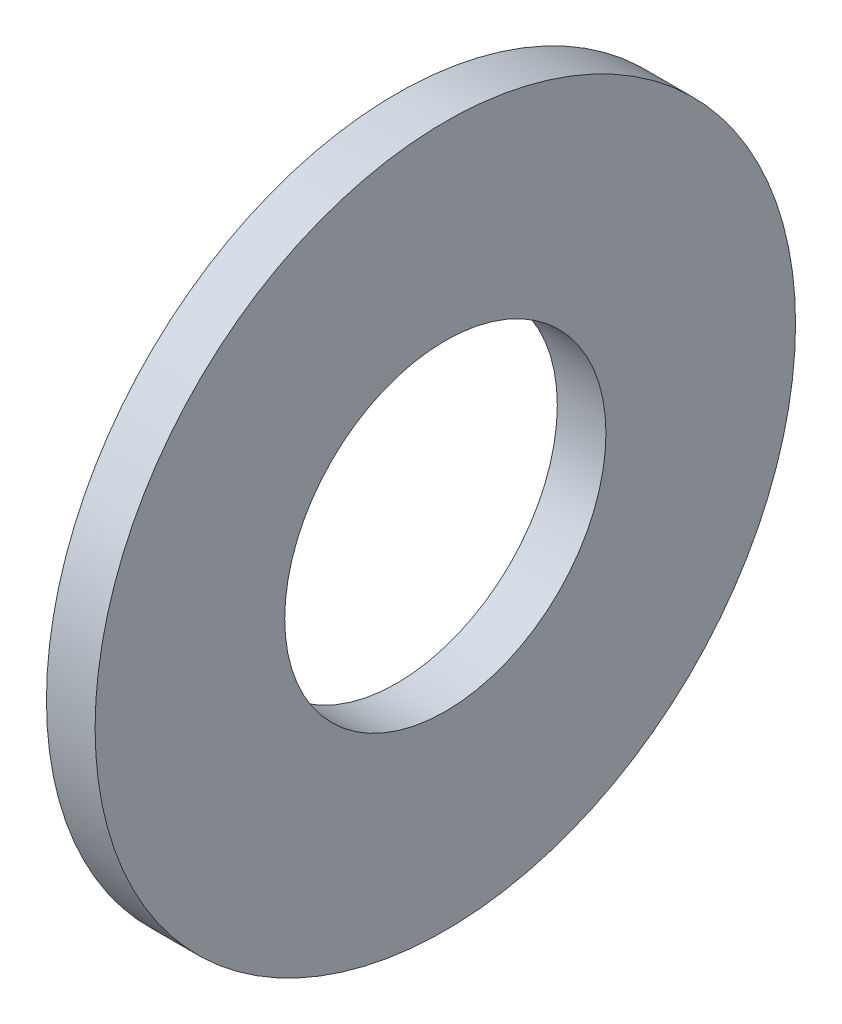
ISO-10303-21;
HEADER;
FILE_DESCRIPTION(('STEP AP214'),'2;1');
FILE_NAME('part.step','',(''),(''),'','','');
FILE_SCHEMA(('AUTOMOTIVE_DESIGN { 1 0 10303 214 1 1 1 1 }'));
ENDSEC;
DATA;
#1=APPLICATION_CONTEXT('core data for automotive mechanical design processes');
#2=APPLICATION_PROTOCOL_DEFINITION('international standard','automotive_design',2000,#1);
#3=PRODUCT_CONTEXT('',#1,'mechanical');
#4=PRODUCT('Part','Part','',(#3));
#5=PRODUCT_RELATED_PRODUCT_CATEGORY('part','',(#4));
#6=PRODUCT_DEFINITION_FORMATION('','',#4);
#7=PRODUCT_DEFINITION_CONTEXT('part definition',#1,'design');
#8=PRODUCT_DEFINITION('design','',#6,#7);
#9=PRODUCT_DEFINITION_SHAPE('','',#8);
#10=(LENGTH_UNIT() NAMED_UNIT(*) SI_UNIT(.MILLI.,.METRE.));
#11=(NAMED_UNIT(*) PLANE_ANGLE_UNIT() SI_UNIT($,.RADIAN.));
#12=(NAMED_UNIT(*) SI_UNIT($,.STERADIAN.) SOLID_ANGLE_UNIT());
#13=UNCERTAINTY_MEASURE_WITH_UNIT(LENGTH_MEASURE(1.E-05),#10,'distance_accuracy_value','');
#14=(GEOMETRIC_REPRESENTATION_CONTEXT(3) GLOBAL_UNCERTAINTY_ASSIGNED_CONTEXT((#13)) GLOBAL_UNIT_ASSIGNED_CONTEXT((#10,
#11,#12)) REPRESENTATION_CONTEXT('',''));
#15=CARTESIAN_POINT('',(0.,0.,0.));
#16=DIRECTION('',(0.,0.,1.));
#17=DIRECTION('',(1.,0.,0.));
#18=AXIS2_PLACEMENT_3D('',#15,#16,#17);
#19=CARTESIAN_POINT('',(-34.9249999999999,0.,0.));
#20=DIRECTION('',(-1.,0.,0.));
#21=DIRECTION('',(0.,0.,1.));
#22=AXIS2_PLACEMENT_3D('',#19,#20,#21);
#23=CYLINDRICAL_SURFACE('',#22,16.51);
#24=CARTESIAN_POINT('',(0.,0.,0.));
#25=DIRECTION('',(-1.,0.,0.));
#26=DIRECTION('',(0.,0.,1.));
#27=AXIS2_PLACEMENT_3D('',#24,#25,#26);
#28=CIRCLE('',#27,16.51);
#29=CARTESIAN_POINT('',(0.,0.,16.51));
#30=VERTEX_POINT('',#29);
#31=EDGE_CURVE('E12',#30,#30,#28,.T.);
#32=ORIENTED_EDGE('',*,*,#31,.F.);
#33=EDGE_LOOP('',(#32));
#34=FACE_BOUND('',#33,.T.);
#35=CARTESIAN_POINT('',(-5.,0.,0.));
#36=DIRECTION('',(-1.,0.,0.));
#37=DIRECTION('',(0.,0.,1.));
#38=AXIS2_PLACEMENT_3D('',#35,#36,#37);
#39=CIRCLE('',#38,16.51);
#40=CARTESIAN_POINT('',(-5.,0.,16.51));
#41=VERTEX_POINT('',#40);
#42=EDGE_CURVE('E70',#41,#41,#39,.T.);
#43=ORIENTED_EDGE('',*,*,#42,.T.);
#44=EDGE_LOOP('',(#43));
#45=FACE_BOUND('',#44,.T.);
#46=ADVANCED_FACE('F53',(#34,#45),#23,.F.);
#47=CARTESIAN_POINT('',(0.,16.51,0.));
#48=DIRECTION('',(-1.,0.,0.));
#49=DIRECTION('',(0.,0.,1.));
#50=AXIS2_PLACEMENT_3D('',#47,#48,#49);
#51=PLANE('',#50);
#52=CARTESIAN_POINT('',(0.,0.,0.));
#53=DIRECTION('',(-1.,0.,0.));
#54=DIRECTION('',(0.,0.,1.));
#55=AXIS2_PLACEMENT_3D('',#52,#53,#54);
#56=CIRCLE('',#55,36.);
#57=CARTESIAN_POINT('',(0.,0.,36.));
#58=VERTEX_POINT('',#57);
#59=EDGE_CURVE('E60',#58,#58,#56,.T.);
#60=ORIENTED_EDGE('',*,*,#59,.F.);
#61=EDGE_LOOP('',(#60));
#62=FACE_BOUND('',#61,.T.);
#63=ORIENTED_EDGE('',*,*,#31,.T.);
#64=EDGE_LOOP('',(#63));
#65=FACE_BOUND('',#64,.T.);
#66=ADVANCED_FACE('F86',(#62,#65),#51,.F.);
#67=CARTESIAN_POINT('',(-34.9249999999999,0.,0.));
#68=DIRECTION('',(-1.,0.,0.));
#69=DIRECTION('',(0.,0.,1.));
#70=AXIS2_PLACEMENT_3D('',#67,#68,#69);
#71=CYLINDRICAL_SURFACE('',#70,36.);
#72=CARTESIAN_POINT('',(-5.,0.,0.));
#73=DIRECTION('',(-1.,0.,0.));
#74=DIRECTION('',(0.,0.,1.));
#75=AXIS2_PLACEMENT_3D('',#72,#73,#74);
#76=CIRCLE('',#75,36.);
#77=CARTESIAN_POINT('',(-5.,0.,36.));
#78=VERTEX_POINT('',#77);
#79=EDGE_CURVE('E65',#78,#78,#76,.T.);
#80=ORIENTED_EDGE('',*,*,#79,.F.);
#81=EDGE_LOOP('',(#80));
#82=FACE_BOUND('',#81,.T.);
#83=ORIENTED_EDGE('',*,*,#59,.T.);
#84=EDGE_LOOP('',(#83));
#85=FACE_BOUND('',#84,.T.);
#86=ADVANCED_FACE('F81',(#82,#85),#71,.T.);
#87=CARTESIAN_POINT('',(-5.,36.,0.));
#88=DIRECTION('',(1.,0.,0.));
#89=DIRECTION('',(0.,0.,-1.));
#90=AXIS2_PLACEMENT_3D('',#87,#88,#89);
#91=PLANE('',#90);
#92=ORIENTED_EDGE('',*,*,#42,.F.);
#93=EDGE_LOOP('',(#92));
#94=FACE_BOUND('',#93,.T.);
#95=ORIENTED_EDGE('',*,*,#79,.T.);
#96=EDGE_LOOP('',(#95));
#97=FACE_BOUND('',#96,.T.);
#98=ADVANCED_FACE('F78',(#94,#97),#91,.F.);
#99=CLOSED_SHELL('',(#46,#66,#86,#98));
#100=MANIFOLD_SOLID_BREP('B2',#99);
#101=ADVANCED_BREP_SHAPE_REPRESENTATION('',(#18,#100),#14);
#102=SHAPE_DEFINITION_REPRESENTATION(#9,#101);
ENDSEC;
END-ISO-10303-21;
